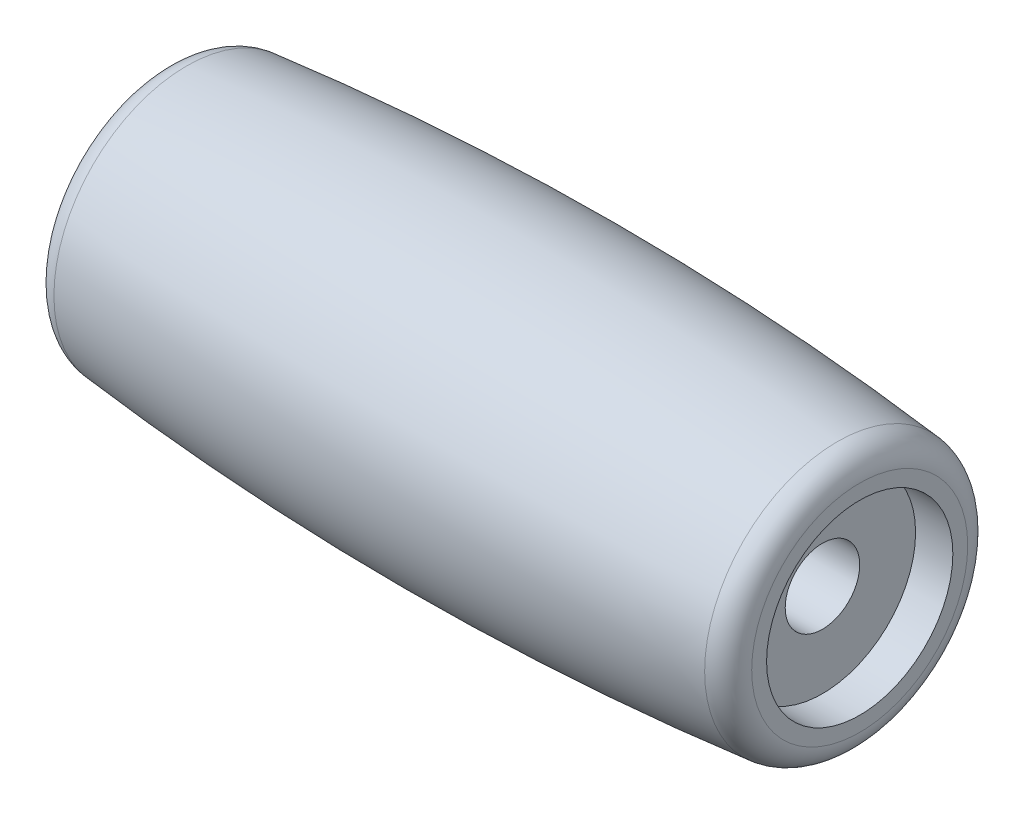
ISO-10303-21;
HEADER;
FILE_DESCRIPTION(('STEP AP214'),'2;1');
FILE_NAME('part.step','',(''),(''),'','','');
FILE_SCHEMA(('AUTOMOTIVE_DESIGN { 1 0 10303 214 1 1 1 1 }'));
ENDSEC;
DATA;
#1=APPLICATION_CONTEXT('core data for automotive mechanical design processes');
#2=APPLICATION_PROTOCOL_DEFINITION('international standard','automotive_design',2000,#1);
#3=PRODUCT_CONTEXT('',#1,'mechanical');
#4=PRODUCT('Part','Part','',(#3));
#5=PRODUCT_RELATED_PRODUCT_CATEGORY('part','',(#4));
#6=PRODUCT_DEFINITION_FORMATION('','',#4);
#7=PRODUCT_DEFINITION_CONTEXT('part definition',#1,'design');
#8=PRODUCT_DEFINITION('design','',#6,#7);
#9=PRODUCT_DEFINITION_SHAPE('','',#8);
#10=(LENGTH_UNIT() NAMED_UNIT(*) SI_UNIT(.MILLI.,.METRE.));
#11=(NAMED_UNIT(*) PLANE_ANGLE_UNIT() SI_UNIT($,.RADIAN.));
#12=(NAMED_UNIT(*) SI_UNIT($,.STERADIAN.) SOLID_ANGLE_UNIT());
#13=UNCERTAINTY_MEASURE_WITH_UNIT(LENGTH_MEASURE(1.E-05),#10,'distance_accuracy_value','');
#14=(GEOMETRIC_REPRESENTATION_CONTEXT(3) GLOBAL_UNCERTAINTY_ASSIGNED_CONTEXT((#13)) GLOBAL_UNIT_ASSIGNED_CONTEXT((#10,
#11,#12)) REPRESENTATION_CONTEXT('',''));
#15=CARTESIAN_POINT('',(0.,0.,0.));
#16=DIRECTION('',(0.,0.,1.));
#17=DIRECTION('',(1.,0.,0.));
#18=AXIS2_PLACEMENT_3D('',#15,#16,#17);
#19=CARTESIAN_POINT('',(24.0606517531726,0.,-16.2464942495366));
#20=DIRECTION('',(1.,0.,0.));
#21=DIRECTION('',(0.,0.,-1.));
#22=AXIS2_PLACEMENT_3D('',#19,#20,#21);
#23=PLANE('',#22);
#24=CARTESIAN_POINT('',(24.0606517531726,0.,-12.4964942495366));
#25=DIRECTION('',(-1.,0.,0.));
#26=DIRECTION('',(0.,0.,1.));
#27=AXIS2_PLACEMENT_3D('',#24,#25,#26);
#28=CIRCLE('',#27,1.5);
#29=CARTESIAN_POINT('',(24.0606517531726,0.,-10.9964942495366));
#30=VERTEX_POINT('',#29);
#31=EDGE_CURVE('E10',#30,#30,#28,.T.);
#32=ORIENTED_EDGE('',*,*,#31,.F.);
#33=EDGE_LOOP('',(#32));
#34=FACE_BOUND('',#33,.T.);
#35=CARTESIAN_POINT('',(24.0606517531726,0.,-12.4964942495366));
#36=DIRECTION('',(-1.,0.,0.));
#37=DIRECTION('',(0.,0.,1.));
#38=AXIS2_PLACEMENT_3D('',#35,#36,#37);
#39=CIRCLE('',#38,3.75);
#40=CARTESIAN_POINT('',(24.0606517531726,0.,-8.74649424953657));
#41=VERTEX_POINT('',#40);
#42=EDGE_CURVE('E71',#41,#41,#39,.T.);
#43=ORIENTED_EDGE('',*,*,#42,.T.);
#44=EDGE_LOOP('',(#43));
#45=FACE_BOUND('',#44,.T.);
#46=ADVANCED_FACE('F37',(#34,#45),#23,.F.);
#47=CARTESIAN_POINT('',(22.5606517531726,0.,-12.4964942495366));
#48=DIRECTION('',(-1.,0.,0.));
#49=DIRECTION('',(0.,0.,1.));
#50=AXIS2_PLACEMENT_3D('',#47,#48,#49);
#51=CYLINDRICAL_SURFACE('',#50,1.5);
#52=CARTESIAN_POINT('',(49.0606517531726,0.,-12.4964942495366));
#53=DIRECTION('',(-1.,0.,0.));
#54=DIRECTION('',(0.,0.,1.));
#55=AXIS2_PLACEMENT_3D('',#52,#53,#54);
#56=CIRCLE('',#55,1.5);
#57=CARTESIAN_POINT('',(49.0606517531726,0.,-10.9964942495366));
#58=VERTEX_POINT('',#57);
#59=EDGE_CURVE('E43',#58,#58,#56,.T.);
#60=ORIENTED_EDGE('',*,*,#59,.F.);
#61=EDGE_LOOP('',(#60));
#62=FACE_BOUND('',#61,.T.);
#63=ORIENTED_EDGE('',*,*,#31,.T.);
#64=EDGE_LOOP('',(#63));
#65=FACE_BOUND('',#64,.T.);
#66=ADVANCED_FACE('F120',(#62,#65),#51,.F.);
#67=CARTESIAN_POINT('',(49.0606517531726,0.,-16.2464942495366));
#68=DIRECTION('',(-1.,0.,0.));
#69=DIRECTION('',(0.,0.,1.));
#70=AXIS2_PLACEMENT_3D('',#67,#68,#69);
#71=PLANE('',#70);
#72=CARTESIAN_POINT('',(49.0606517531726,0.,-12.4964942495366));
#73=DIRECTION('',(-1.,0.,0.));
#74=DIRECTION('',(0.,0.,1.));
#75=AXIS2_PLACEMENT_3D('',#72,#73,#74);
#76=CIRCLE('',#75,3.75);
#77=CARTESIAN_POINT('',(49.0606517531726,0.,-8.74649424953657));
#78=VERTEX_POINT('',#77);
#79=EDGE_CURVE('E47',#78,#78,#76,.T.);
#80=ORIENTED_EDGE('',*,*,#79,.F.);
#81=EDGE_LOOP('',(#80));
#82=FACE_BOUND('',#81,.T.);
#83=ORIENTED_EDGE('',*,*,#59,.T.);
#84=EDGE_LOOP('',(#83));
#85=FACE_BOUND('',#84,.T.);
#86=ADVANCED_FACE('F115',(#82,#85),#71,.F.);
#87=CARTESIAN_POINT('',(22.5606517531726,0.,-12.4964942495366));
#88=DIRECTION('',(-1.,0.,0.));
#89=DIRECTION('',(0.,0.,1.));
#90=AXIS2_PLACEMENT_3D('',#87,#88,#89);
#91=CYLINDRICAL_SURFACE('',#90,3.75);
#92=CARTESIAN_POINT('',(50.5606517531726,0.,-12.4964942495366));
#93=DIRECTION('',(-1.,0.,0.));
#94=DIRECTION('',(0.,0.,1.));
#95=AXIS2_PLACEMENT_3D('',#92,#93,#94);
#96=CIRCLE('',#95,3.75);
#97=CARTESIAN_POINT('',(50.5606517531726,0.,-8.74649424953657));
#98=VERTEX_POINT('',#97);
#99=EDGE_CURVE('E51',#98,#98,#96,.T.);
#100=ORIENTED_EDGE('',*,*,#99,.F.);
#101=EDGE_LOOP('',(#100));
#102=FACE_BOUND('',#101,.T.);
#103=ORIENTED_EDGE('',*,*,#79,.T.);
#104=EDGE_LOOP('',(#103));
#105=FACE_BOUND('',#104,.T.);
#106=ADVANCED_FACE('F109',(#102,#105),#91,.F.);
#107=CARTESIAN_POINT('',(50.5606517531726,0.,-16.2464942495366));
#108=DIRECTION('',(-1.,0.,0.));
#109=DIRECTION('',(0.,0.,1.));
#110=AXIS2_PLACEMENT_3D('',#107,#108,#109);
#111=PLANE('',#110);
#112=CARTESIAN_POINT('',(50.5606517531726,0.,-12.4964942495366));
#113=DIRECTION('',(-1.,0.,0.));
#114=DIRECTION('',(0.,0.,1.));
#115=AXIS2_PLACEMENT_3D('',#112,#113,#114);
#116=CIRCLE('',#115,4.34857666506388);
#117=CARTESIAN_POINT('',(50.5606517531726,0.,-8.14791758447269));
#118=VERTEX_POINT('',#117);
#119=EDGE_CURVE('E56',#118,#118,#116,.T.);
#120=ORIENTED_EDGE('',*,*,#119,.F.);
#121=EDGE_LOOP('',(#120));
#122=FACE_BOUND('',#121,.T.);
#123=ORIENTED_EDGE('',*,*,#99,.T.);
#124=EDGE_LOOP('',(#123));
#125=FACE_BOUND('',#124,.T.);
#126=ADVANCED_FACE('F103',(#122,#125),#111,.F.);
#127=CARTESIAN_POINT('',(49.5606517531726,0.,-12.4964942495366));
#128=DIRECTION('',(-1.,0.,0.));
#129=DIRECTION('',(0.,0.,1.));
#130=AXIS2_PLACEMENT_3D('',#127,#128,#129);
#131=TOROIDAL_SURFACE('',#130,4.34857666506388,1.);
#132=CARTESIAN_POINT('',(49.66061971216,0.,-12.4964942495366));
#133=DIRECTION('',(-1.,0.,0.));
#134=DIRECTION('',(0.,0.,1.));
#135=AXIS2_PLACEMENT_3D('',#132,#133,#134);
#136=CIRCLE('',#135,5.34356732189231);
#137=CARTESIAN_POINT('',(49.66061971216,0.,-7.15292692764426));
#138=VERTEX_POINT('',#137);
#139=EDGE_CURVE('E59',#138,#138,#136,.T.);
#140=ORIENTED_EDGE('',*,*,#139,.F.);
#141=EDGE_LOOP('',(#140));
#142=FACE_BOUND('',#141,.T.);
#143=ORIENTED_EDGE('',*,*,#119,.T.);
#144=EDGE_LOOP('',(#143));
#145=FACE_BOUND('',#144,.T.);
#146=ADVANCED_FACE('F97',(#142,#145),#131,.T.);
#147=CARTESIAN_POINT('',(36.5606517531726,0.,-12.4964942495366));
#148=DIRECTION('',(-1.,0.,0.));
#149=DIRECTION('',(0.,0.,1.));
#150=AXIS2_PLACEMENT_3D('',#147,#148,#149);
#151=DEGENERATE_TOROIDAL_SURFACE('',#150,125.041666666673,131.041666666673,.F.);
#152=CARTESIAN_POINT('',(23.4606837941851,0.,-12.4964942495366));
#153=DIRECTION('',(-1.,0.,0.));
#154=DIRECTION('',(0.,0.,1.));
#155=AXIS2_PLACEMENT_3D('',#152,#153,#154);
#156=CIRCLE('',#155,5.34356732189234);
#157=CARTESIAN_POINT('',(23.4606837941851,0.,-7.15292692764423));
#158=VERTEX_POINT('',#157);
#159=EDGE_CURVE('E62',#158,#158,#156,.T.);
#160=ORIENTED_EDGE('',*,*,#159,.F.);
#161=EDGE_LOOP('',(#160));
#162=FACE_BOUND('',#161,.T.);
#163=ORIENTED_EDGE('',*,*,#139,.T.);
#164=EDGE_LOOP('',(#163));
#165=FACE_BOUND('',#164,.T.);
#166=ADVANCED_FACE('F91',(#162,#165),#151,.F.);
#167=CARTESIAN_POINT('',(23.5606517531726,0.,-12.4964942495366));
#168=DIRECTION('',(-1.,0.,0.));
#169=DIRECTION('',(0.,0.,1.));
#170=AXIS2_PLACEMENT_3D('',#167,#168,#169);
#171=TOROIDAL_SURFACE('',#170,4.34857666506391,1.);
#172=CARTESIAN_POINT('',(22.5606517531726,0.,-12.4964942495366));
#173=DIRECTION('',(-1.,0.,0.));
#174=DIRECTION('',(0.,0.,1.));
#175=AXIS2_PLACEMENT_3D('',#172,#173,#174);
#176=CIRCLE('',#175,4.34857666506391);
#177=CARTESIAN_POINT('',(22.5606517531726,0.,-8.14791758447266));
#178=VERTEX_POINT('',#177);
#179=EDGE_CURVE('E65',#178,#178,#176,.T.);
#180=ORIENTED_EDGE('',*,*,#179,.F.);
#181=EDGE_LOOP('',(#180));
#182=FACE_BOUND('',#181,.T.);
#183=ORIENTED_EDGE('',*,*,#159,.T.);
#184=EDGE_LOOP('',(#183));
#185=FACE_BOUND('',#184,.T.);
#186=ADVANCED_FACE('F85',(#182,#185),#171,.T.);
#187=CARTESIAN_POINT('',(22.5606517531726,0.,-16.2464942495366));
#188=DIRECTION('',(1.,0.,0.));
#189=DIRECTION('',(0.,0.,-1.));
#190=AXIS2_PLACEMENT_3D('',#187,#188,#189);
#191=PLANE('',#190);
#192=CARTESIAN_POINT('',(22.5606517531726,0.,-12.4964942495366));
#193=DIRECTION('',(-1.,0.,0.));
#194=DIRECTION('',(0.,0.,1.));
#195=AXIS2_PLACEMENT_3D('',#192,#193,#194);
#196=CIRCLE('',#195,3.75);
#197=CARTESIAN_POINT('',(22.5606517531726,0.,-8.74649424953657));
#198=VERTEX_POINT('',#197);
#199=EDGE_CURVE('E68',#198,#198,#196,.T.);
#200=ORIENTED_EDGE('',*,*,#199,.F.);
#201=EDGE_LOOP('',(#200));
#202=FACE_BOUND('',#201,.T.);
#203=ORIENTED_EDGE('',*,*,#179,.T.);
#204=EDGE_LOOP('',(#203));
#205=FACE_BOUND('',#204,.T.);
#206=ADVANCED_FACE('F79',(#202,#205),#191,.F.);
#207=CARTESIAN_POINT('',(22.5606517531726,0.,-12.4964942495366));
#208=DIRECTION('',(-1.,0.,0.));
#209=DIRECTION('',(0.,0.,1.));
#210=AXIS2_PLACEMENT_3D('',#207,#208,#209);
#211=CYLINDRICAL_SURFACE('',#210,3.75);
#212=ORIENTED_EDGE('',*,*,#42,.F.);
#213=EDGE_LOOP('',(#212));
#214=FACE_BOUND('',#213,.T.);
#215=ORIENTED_EDGE('',*,*,#199,.T.);
#216=EDGE_LOOP('',(#215));
#217=FACE_BOUND('',#216,.T.);
#218=ADVANCED_FACE('F76',(#214,#217),#211,.F.);
#219=CLOSED_SHELL('',(#46,#66,#86,#106,#126,#146,#166,#186,#206,#218));
#220=MANIFOLD_SOLID_BREP('B2',#219);
#221=ADVANCED_BREP_SHAPE_REPRESENTATION('',(#18,#220),#14);
#222=SHAPE_DEFINITION_REPRESENTATION(#9,#221);
ENDSEC;
END-ISO-10303-21;
